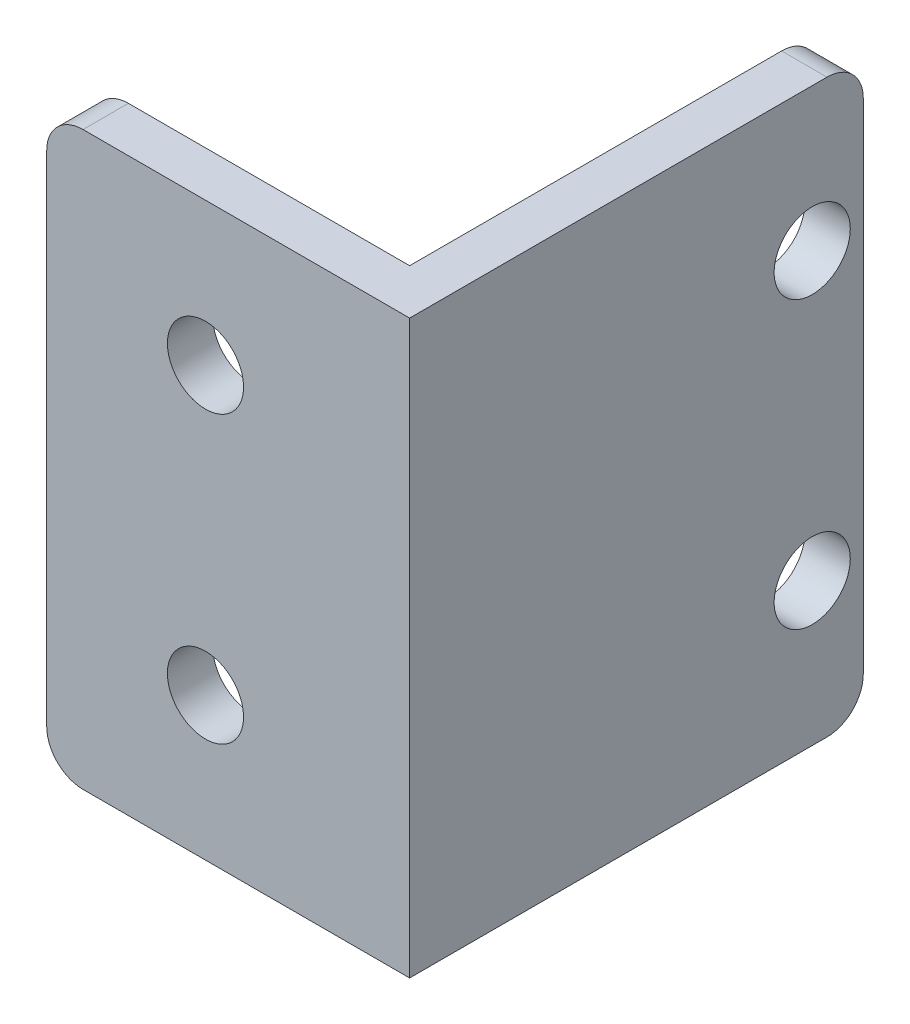
ISO-10303-21;
HEADER;
FILE_DESCRIPTION(('STEP AP214'),'2;1');
FILE_NAME('part.step','',(''),(''),'','','');
FILE_SCHEMA(('AUTOMOTIVE_DESIGN { 1 0 10303 214 1 1 1 1 }'));
ENDSEC;
DATA;
#1=APPLICATION_CONTEXT('core data for automotive mechanical design processes');
#2=APPLICATION_PROTOCOL_DEFINITION('international standard','automotive_design',2000,#1);
#3=PRODUCT_CONTEXT('',#1,'mechanical');
#4=PRODUCT('Part','Part','',(#3));
#5=PRODUCT_RELATED_PRODUCT_CATEGORY('part','',(#4));
#6=PRODUCT_DEFINITION_FORMATION('','',#4);
#7=PRODUCT_DEFINITION_CONTEXT('part definition',#1,'design');
#8=PRODUCT_DEFINITION('design','',#6,#7);
#9=PRODUCT_DEFINITION_SHAPE('','',#8);
#10=(LENGTH_UNIT() NAMED_UNIT(*) SI_UNIT(.MILLI.,.METRE.));
#11=(NAMED_UNIT(*) PLANE_ANGLE_UNIT() SI_UNIT($,.RADIAN.));
#12=(NAMED_UNIT(*) SI_UNIT($,.STERADIAN.) SOLID_ANGLE_UNIT());
#13=UNCERTAINTY_MEASURE_WITH_UNIT(LENGTH_MEASURE(1.E-05),#10,'distance_accuracy_value','');
#14=(GEOMETRIC_REPRESENTATION_CONTEXT(3) GLOBAL_UNCERTAINTY_ASSIGNED_CONTEXT((#13)) GLOBAL_UNIT_ASSIGNED_CONTEXT((#10,
#11,#12)) REPRESENTATION_CONTEXT('',''));
#15=CARTESIAN_POINT('',(0.,0.,0.));
#16=DIRECTION('',(0.,0.,1.));
#17=DIRECTION('',(1.,0.,0.));
#18=AXIS2_PLACEMENT_3D('',#15,#16,#17);
#19=CARTESIAN_POINT('',(0.,40.,-31.75));
#20=DIRECTION('',(-1.,0.,0.));
#21=DIRECTION('',(0.,0.,1.));
#22=AXIS2_PLACEMENT_3D('',#19,#20,#21);
#23=PLANE('',#22);
#24=CARTESIAN_POINT('',(0.,10.,-28.17625));
#25=DIRECTION('',(1.,0.,0.));
#26=DIRECTION('',(0.,0.,-1.));
#27=AXIS2_PLACEMENT_3D('',#24,#25,#26);
#28=CIRCLE('',#27,2.665);
#29=CARTESIAN_POINT('',(0.,10.,-30.84125));
#30=VERTEX_POINT('',#29);
#31=EDGE_CURVE('E247',#30,#30,#28,.T.);
#32=ORIENTED_EDGE('',*,*,#31,.F.);
#33=EDGE_LOOP('',(#32));
#34=FACE_BOUND('',#33,.T.);
#35=CARTESIAN_POINT('',(0.,30.,-28.17625));
#36=DIRECTION('',(1.,0.,0.));
#37=DIRECTION('',(0.,0.,-1.));
#38=AXIS2_PLACEMENT_3D('',#35,#36,#37);
#39=CIRCLE('',#38,2.665);
#40=CARTESIAN_POINT('',(0.,30.,-30.84125));
#41=VERTEX_POINT('',#40);
#42=EDGE_CURVE('E248',#41,#41,#39,.T.);
#43=ORIENTED_EDGE('',*,*,#42,.F.);
#44=EDGE_LOOP('',(#43));
#45=FACE_BOUND('',#44,.T.);
#46=DIRECTION('',(0.,-1.,0.));
#47=VECTOR('',#46,1.);
#48=CARTESIAN_POINT('',(0.,40.,-31.75));
#49=LINE('',#48,#47);
#50=CARTESIAN_POINT('',(0.,37.46,-31.75));
#51=VERTEX_POINT('',#50);
#52=CARTESIAN_POINT('',(0.,2.54,-31.75));
#53=VERTEX_POINT('',#52);
#54=EDGE_CURVE('E201',#51,#53,#49,.T.);
#55=ORIENTED_EDGE('',*,*,#54,.F.);
#56=CARTESIAN_POINT('',(0.,37.46,-29.21));
#57=DIRECTION('',(-1.,0.,0.));
#58=DIRECTION('',(0.,0.,1.));
#59=AXIS2_PLACEMENT_3D('',#56,#57,#58);
#60=CIRCLE('',#59,2.54);
#61=CARTESIAN_POINT('',(0.,40.,-29.21));
#62=VERTEX_POINT('',#61);
#63=EDGE_CURVE('E11',#51,#62,#60,.F.);
#64=ORIENTED_EDGE('',*,*,#63,.T.);
#65=DIRECTION('',(0.,0.,-1.));
#66=VECTOR('',#65,1.);
#67=CARTESIAN_POINT('',(0.,40.,-31.75));
#68=LINE('',#67,#66);
#69=CARTESIAN_POINT('',(0.,40.,0.));
#70=VERTEX_POINT('',#69);
#71=EDGE_CURVE('E149',#70,#62,#68,.T.);
#72=ORIENTED_EDGE('',*,*,#71,.F.);
#73=DIRECTION('',(0.,-1.,0.));
#74=VECTOR('',#73,1.);
#75=CARTESIAN_POINT('',(0.,40.,0.));
#76=LINE('',#75,#74);
#77=CARTESIAN_POINT('',(0.,0.,0.));
#78=VERTEX_POINT('',#77);
#79=EDGE_CURVE('E172',#70,#78,#76,.T.);
#80=ORIENTED_EDGE('',*,*,#79,.T.);
#81=DIRECTION('',(0.,0.,-1.));
#82=VECTOR('',#81,1.);
#83=CARTESIAN_POINT('',(0.,0.,-31.75));
#84=LINE('',#83,#82);
#85=CARTESIAN_POINT('',(0.,0.,-29.21));
#86=VERTEX_POINT('',#85);
#87=EDGE_CURVE('E176',#78,#86,#84,.T.);
#88=ORIENTED_EDGE('',*,*,#87,.T.);
#89=CARTESIAN_POINT('',(0.,2.54,-29.21));
#90=DIRECTION('',(-1.,0.,0.));
#91=DIRECTION('',(0.,0.,1.));
#92=AXIS2_PLACEMENT_3D('',#89,#90,#91);
#93=CIRCLE('',#92,2.54);
#94=EDGE_CURVE('E47',#86,#53,#93,.F.);
#95=ORIENTED_EDGE('',*,*,#94,.T.);
#96=EDGE_LOOP('',(#55,#64,#72,#80,#88,#95));
#97=FACE_BOUND('',#96,.T.);
#98=ADVANCED_FACE('F38',(#34,#45,#97),#23,.F.);
#99=CARTESIAN_POINT('',(-3.175,40.,-31.75));
#100=DIRECTION('',(0.,0.,1.));
#101=DIRECTION('',(1.,0.,0.));
#102=AXIS2_PLACEMENT_3D('',#99,#100,#101);
#103=PLANE('',#102);
#104=DIRECTION('',(0.,-1.,0.));
#105=VECTOR('',#104,1.);
#106=CARTESIAN_POINT('',(-3.175,40.,-31.75));
#107=LINE('',#106,#105);
#108=CARTESIAN_POINT('',(-3.175,37.46,-31.75));
#109=VERTEX_POINT('',#108);
#110=CARTESIAN_POINT('',(-3.175,2.54,-31.75));
#111=VERTEX_POINT('',#110);
#112=EDGE_CURVE('E160',#109,#111,#107,.T.);
#113=ORIENTED_EDGE('',*,*,#112,.F.);
#114=DIRECTION('',(-1.,0.,0.));
#115=VECTOR('',#114,1.);
#116=CARTESIAN_POINT('',(-3.175,37.46,-31.75));
#117=LINE('',#116,#115);
#118=EDGE_CURVE('E66',#109,#51,#117,.F.);
#119=ORIENTED_EDGE('',*,*,#118,.T.);
#120=ORIENTED_EDGE('',*,*,#54,.T.);
#121=DIRECTION('',(-1.,0.,0.));
#122=VECTOR('',#121,1.);
#123=CARTESIAN_POINT('',(-3.175,2.54,-31.75));
#124=LINE('',#123,#122);
#125=EDGE_CURVE('E238',#53,#111,#124,.T.);
#126=ORIENTED_EDGE('',*,*,#125,.T.);
#127=EDGE_LOOP('',(#113,#119,#120,#126));
#128=FACE_BOUND('',#127,.T.);
#129=ADVANCED_FACE('F280',(#128),#103,.F.);
#130=CARTESIAN_POINT('',(-3.175,40.,-3.175));
#131=DIRECTION('',(1.,0.,0.));
#132=DIRECTION('',(0.,0.,-1.));
#133=AXIS2_PLACEMENT_3D('',#130,#131,#132);
#134=PLANE('',#133);
#135=CARTESIAN_POINT('',(-3.175,10.,-28.17625));
#136=DIRECTION('',(1.,0.,0.));
#137=DIRECTION('',(0.,0.,-1.));
#138=AXIS2_PLACEMENT_3D('',#135,#136,#137);
#139=CIRCLE('',#138,2.665);
#140=CARTESIAN_POINT('',(-3.175,10.,-30.84125));
#141=VERTEX_POINT('',#140);
#142=EDGE_CURVE('E256',#141,#141,#139,.F.);
#143=ORIENTED_EDGE('',*,*,#142,.F.);
#144=EDGE_LOOP('',(#143));
#145=FACE_BOUND('',#144,.T.);
#146=CARTESIAN_POINT('',(-3.175,30.,-28.17625));
#147=DIRECTION('',(1.,0.,0.));
#148=DIRECTION('',(0.,0.,-1.));
#149=AXIS2_PLACEMENT_3D('',#146,#147,#148);
#150=CIRCLE('',#149,2.665);
#151=CARTESIAN_POINT('',(-3.175,30.,-30.84125));
#152=VERTEX_POINT('',#151);
#153=EDGE_CURVE('E245',#152,#152,#150,.F.);
#154=ORIENTED_EDGE('',*,*,#153,.F.);
#155=EDGE_LOOP('',(#154));
#156=FACE_BOUND('',#155,.T.);
#157=DIRECTION('',(0.,0.,1.));
#158=VECTOR('',#157,1.);
#159=CARTESIAN_POINT('',(-3.175,40.,-3.175));
#160=LINE('',#159,#158);
#161=CARTESIAN_POINT('',(-3.175,40.,-29.21));
#162=VERTEX_POINT('',#161);
#163=CARTESIAN_POINT('',(-3.175,40.,-3.175));
#164=VERTEX_POINT('',#163);
#165=EDGE_CURVE('E137',#162,#164,#160,.T.);
#166=ORIENTED_EDGE('',*,*,#165,.F.);
#167=CARTESIAN_POINT('',(-3.175,37.46,-29.21));
#168=DIRECTION('',(1.,0.,0.));
#169=DIRECTION('',(0.,0.,-1.));
#170=AXIS2_PLACEMENT_3D('',#167,#168,#169);
#171=CIRCLE('',#170,2.54);
#172=EDGE_CURVE('E235',#162,#109,#171,.F.);
#173=ORIENTED_EDGE('',*,*,#172,.T.);
#174=ORIENTED_EDGE('',*,*,#112,.T.);
#175=CARTESIAN_POINT('',(-3.175,2.54,-29.21));
#176=DIRECTION('',(1.,0.,0.));
#177=DIRECTION('',(0.,0.,-1.));
#178=AXIS2_PLACEMENT_3D('',#175,#176,#177);
#179=CIRCLE('',#178,2.54);
#180=CARTESIAN_POINT('',(-3.175,0.,-29.21));
#181=VERTEX_POINT('',#180);
#182=EDGE_CURVE('E232',#111,#181,#179,.F.);
#183=ORIENTED_EDGE('',*,*,#182,.T.);
#184=DIRECTION('',(0.,0.,1.));
#185=VECTOR('',#184,1.);
#186=CARTESIAN_POINT('',(-3.175,0.,-3.175));
#187=LINE('',#186,#185);
#188=CARTESIAN_POINT('',(-3.175,0.,-3.175));
#189=VERTEX_POINT('',#188);
#190=EDGE_CURVE('E155',#181,#189,#187,.T.);
#191=ORIENTED_EDGE('',*,*,#190,.T.);
#192=DIRECTION('',(0.,-1.,0.));
#193=VECTOR('',#192,1.);
#194=CARTESIAN_POINT('',(-3.175,40.,-3.175));
#195=LINE('',#194,#193);
#196=EDGE_CURVE('E152',#164,#189,#195,.T.);
#197=ORIENTED_EDGE('',*,*,#196,.F.);
#198=EDGE_LOOP('',(#166,#173,#174,#183,#191,#197));
#199=FACE_BOUND('',#198,.T.);
#200=ADVANCED_FACE('F153',(#145,#156,#199),#134,.F.);
#201=CARTESIAN_POINT('',(-25.4,40.,-3.175));
#202=DIRECTION('',(0.,0.,1.));
#203=DIRECTION('',(1.,0.,0.));
#204=AXIS2_PLACEMENT_3D('',#201,#202,#203);
#205=PLANE('',#204);
#206=CARTESIAN_POINT('',(-14.2875,30.,-3.175));
#207=DIRECTION('',(0.,0.,-1.));
#208=DIRECTION('',(-1.,0.,0.));
#209=AXIS2_PLACEMENT_3D('',#206,#207,#208);
#210=CIRCLE('',#209,2.665);
#211=CARTESIAN_POINT('',(-16.9525,30.,-3.175));
#212=VERTEX_POINT('',#211);
#213=EDGE_CURVE('E259',#212,#212,#210,.T.);
#214=ORIENTED_EDGE('',*,*,#213,.F.);
#215=EDGE_LOOP('',(#214));
#216=FACE_BOUND('',#215,.T.);
#217=CARTESIAN_POINT('',(-14.2875,10.,-3.175));
#218=DIRECTION('',(0.,0.,-1.));
#219=DIRECTION('',(-1.,0.,0.));
#220=AXIS2_PLACEMENT_3D('',#217,#218,#219);
#221=CIRCLE('',#220,2.665);
#222=CARTESIAN_POINT('',(-16.9525,10.,-3.175));
#223=VERTEX_POINT('',#222);
#224=EDGE_CURVE('E267',#223,#223,#221,.T.);
#225=ORIENTED_EDGE('',*,*,#224,.F.);
#226=EDGE_LOOP('',(#225));
#227=FACE_BOUND('',#226,.T.);
#228=DIRECTION('',(-1.,0.,0.));
#229=VECTOR('',#228,1.);
#230=CARTESIAN_POINT('',(-25.4,0.,-3.175));
#231=LINE('',#230,#229);
#232=CARTESIAN_POINT('',(-22.86,0.,-3.175));
#233=VERTEX_POINT('',#232);
#234=EDGE_CURVE('E182',#189,#233,#231,.T.);
#235=ORIENTED_EDGE('',*,*,#234,.T.);
#236=CARTESIAN_POINT('',(-22.86,2.54,-3.175));
#237=DIRECTION('',(0.,0.,1.));
#238=DIRECTION('',(1.,0.,0.));
#239=AXIS2_PLACEMENT_3D('',#236,#237,#238);
#240=CIRCLE('',#239,2.54);
#241=CARTESIAN_POINT('',(-25.4,2.54,-3.175));
#242=VERTEX_POINT('',#241);
#243=EDGE_CURVE('E225',#233,#242,#240,.F.);
#244=ORIENTED_EDGE('',*,*,#243,.T.);
#245=DIRECTION('',(0.,-1.,0.));
#246=VECTOR('',#245,1.);
#247=CARTESIAN_POINT('',(-25.4,40.,-3.175));
#248=LINE('',#247,#246);
#249=CARTESIAN_POINT('',(-25.4,37.46,-3.175));
#250=VERTEX_POINT('',#249);
#251=EDGE_CURVE('E161',#250,#242,#248,.T.);
#252=ORIENTED_EDGE('',*,*,#251,.F.);
#253=CARTESIAN_POINT('',(-22.86,37.46,-3.175));
#254=DIRECTION('',(0.,0.,1.));
#255=DIRECTION('',(1.,0.,0.));
#256=AXIS2_PLACEMENT_3D('',#253,#254,#255);
#257=CIRCLE('',#256,2.54);
#258=CARTESIAN_POINT('',(-22.86,40.,-3.175));
#259=VERTEX_POINT('',#258);
#260=EDGE_CURVE('E166',#250,#259,#257,.F.);
#261=ORIENTED_EDGE('',*,*,#260,.T.);
#262=DIRECTION('',(-1.,0.,0.));
#263=VECTOR('',#262,1.);
#264=CARTESIAN_POINT('',(-25.4,40.,-3.175));
#265=LINE('',#264,#263);
#266=EDGE_CURVE('E142',#164,#259,#265,.T.);
#267=ORIENTED_EDGE('',*,*,#266,.F.);
#268=ORIENTED_EDGE('',*,*,#196,.T.);
#269=EDGE_LOOP('',(#235,#244,#252,#261,#267,#268));
#270=FACE_BOUND('',#269,.T.);
#271=ADVANCED_FACE('F163',(#216,#227,#270),#205,.F.);
#272=CARTESIAN_POINT('',(-25.4,40.,0.));
#273=DIRECTION('',(1.,0.,0.));
#274=DIRECTION('',(0.,0.,-1.));
#275=AXIS2_PLACEMENT_3D('',#272,#273,#274);
#276=PLANE('',#275);
#277=ORIENTED_EDGE('',*,*,#251,.T.);
#278=DIRECTION('',(0.,0.,1.));
#279=VECTOR('',#278,1.);
#280=CARTESIAN_POINT('',(-25.4,2.54,0.));
#281=LINE('',#280,#279);
#282=CARTESIAN_POINT('',(-25.4,2.54,0.));
#283=VERTEX_POINT('',#282);
#284=EDGE_CURVE('E207',#242,#283,#281,.T.);
#285=ORIENTED_EDGE('',*,*,#284,.T.);
#286=DIRECTION('',(0.,-1.,0.));
#287=VECTOR('',#286,1.);
#288=CARTESIAN_POINT('',(-25.4,40.,0.));
#289=LINE('',#288,#287);
#290=CARTESIAN_POINT('',(-25.4,37.46,0.));
#291=VERTEX_POINT('',#290);
#292=EDGE_CURVE('E191',#291,#283,#289,.T.);
#293=ORIENTED_EDGE('',*,*,#292,.F.);
#294=DIRECTION('',(0.,0.,1.));
#295=VECTOR('',#294,1.);
#296=CARTESIAN_POINT('',(-25.4,37.46,0.));
#297=LINE('',#296,#295);
#298=EDGE_CURVE('E204',#291,#250,#297,.F.);
#299=ORIENTED_EDGE('',*,*,#298,.T.);
#300=EDGE_LOOP('',(#277,#285,#293,#299));
#301=FACE_BOUND('',#300,.T.);
#302=ADVANCED_FACE('F295',(#301),#276,.F.);
#303=CARTESIAN_POINT('',(0.,40.,0.));
#304=DIRECTION('',(0.,0.,-1.));
#305=DIRECTION('',(-1.,0.,0.));
#306=AXIS2_PLACEMENT_3D('',#303,#304,#305);
#307=PLANE('',#306);
#308=CARTESIAN_POINT('',(-14.2875,30.,0.));
#309=DIRECTION('',(0.,0.,-1.));
#310=DIRECTION('',(-1.,0.,0.));
#311=AXIS2_PLACEMENT_3D('',#308,#309,#310);
#312=CIRCLE('',#311,2.665);
#313=CARTESIAN_POINT('',(-16.9525,30.,0.));
#314=VERTEX_POINT('',#313);
#315=EDGE_CURVE('E179',#314,#314,#312,.F.);
#316=ORIENTED_EDGE('',*,*,#315,.F.);
#317=EDGE_LOOP('',(#316));
#318=FACE_BOUND('',#317,.T.);
#319=CARTESIAN_POINT('',(-14.2875,10.,0.));
#320=DIRECTION('',(0.,0.,-1.));
#321=DIRECTION('',(-1.,0.,0.));
#322=AXIS2_PLACEMENT_3D('',#319,#320,#321);
#323=CIRCLE('',#322,2.665);
#324=CARTESIAN_POINT('',(-16.9525,10.,0.));
#325=VERTEX_POINT('',#324);
#326=EDGE_CURVE('E263',#325,#325,#323,.F.);
#327=ORIENTED_EDGE('',*,*,#326,.F.);
#328=EDGE_LOOP('',(#327));
#329=FACE_BOUND('',#328,.T.);
#330=ORIENTED_EDGE('',*,*,#292,.T.);
#331=CARTESIAN_POINT('',(-22.86,2.54,0.));
#332=DIRECTION('',(0.,0.,-1.));
#333=DIRECTION('',(-1.,0.,0.));
#334=AXIS2_PLACEMENT_3D('',#331,#332,#333);
#335=CIRCLE('',#334,2.54);
#336=CARTESIAN_POINT('',(-22.86,0.,0.));
#337=VERTEX_POINT('',#336);
#338=EDGE_CURVE('E214',#283,#337,#335,.F.);
#339=ORIENTED_EDGE('',*,*,#338,.T.);
#340=DIRECTION('',(1.,0.,0.));
#341=VECTOR('',#340,1.);
#342=CARTESIAN_POINT('',(0.,0.,0.));
#343=LINE('',#342,#341);
#344=EDGE_CURVE('E185',#337,#78,#343,.T.);
#345=ORIENTED_EDGE('',*,*,#344,.T.);
#346=ORIENTED_EDGE('',*,*,#79,.F.);
#347=DIRECTION('',(1.,0.,0.));
#348=VECTOR('',#347,1.);
#349=CARTESIAN_POINT('',(0.,40.,0.));
#350=LINE('',#349,#348);
#351=CARTESIAN_POINT('',(-22.86,40.,0.));
#352=VERTEX_POINT('',#351);
#353=EDGE_CURVE('E168',#352,#70,#350,.T.);
#354=ORIENTED_EDGE('',*,*,#353,.F.);
#355=CARTESIAN_POINT('',(-22.86,37.46,0.));
#356=DIRECTION('',(0.,0.,-1.));
#357=DIRECTION('',(-1.,0.,0.));
#358=AXIS2_PLACEMENT_3D('',#355,#356,#357);
#359=CIRCLE('',#358,2.54);
#360=EDGE_CURVE('E211',#352,#291,#359,.F.);
#361=ORIENTED_EDGE('',*,*,#360,.T.);
#362=EDGE_LOOP('',(#330,#339,#345,#346,#354,#361));
#363=FACE_BOUND('',#362,.T.);
#364=ADVANCED_FACE('F298',(#318,#329,#363),#307,.F.);
#365=CARTESIAN_POINT('',(0.,40.,0.));
#366=DIRECTION('',(0.,-1.,0.));
#367=DIRECTION('',(0.,0.,-1.));
#368=AXIS2_PLACEMENT_3D('',#365,#366,#367);
#369=PLANE('',#368);
#370=ORIENTED_EDGE('',*,*,#266,.T.);
#371=DIRECTION('',(0.,0.,1.));
#372=VECTOR('',#371,1.);
#373=CARTESIAN_POINT('',(-22.86,40.,0.));
#374=LINE('',#373,#372);
#375=EDGE_CURVE('E230',#259,#352,#374,.T.);
#376=ORIENTED_EDGE('',*,*,#375,.T.);
#377=ORIENTED_EDGE('',*,*,#353,.T.);
#378=ORIENTED_EDGE('',*,*,#71,.T.);
#379=DIRECTION('',(-1.,0.,0.));
#380=VECTOR('',#379,1.);
#381=CARTESIAN_POINT('',(0.,40.,-29.21));
#382=LINE('',#381,#380);
#383=EDGE_CURVE('E146',#62,#162,#382,.T.);
#384=ORIENTED_EDGE('',*,*,#383,.T.);
#385=ORIENTED_EDGE('',*,*,#165,.T.);
#386=EDGE_LOOP('',(#370,#376,#377,#378,#384,#385));
#387=FACE_BOUND('',#386,.T.);
#388=ADVANCED_FACE('F139',(#387),#369,.F.);
#389=CARTESIAN_POINT('',(0.,0.,0.));
#390=DIRECTION('',(0.,-1.,0.));
#391=DIRECTION('',(0.,0.,-1.));
#392=AXIS2_PLACEMENT_3D('',#389,#390,#391);
#393=PLANE('',#392);
#394=ORIENTED_EDGE('',*,*,#344,.F.);
#395=DIRECTION('',(0.,0.,1.));
#396=VECTOR('',#395,1.);
#397=CARTESIAN_POINT('',(-22.86,0.,-3.175));
#398=LINE('',#397,#396);
#399=EDGE_CURVE('E220',#337,#233,#398,.F.);
#400=ORIENTED_EDGE('',*,*,#399,.T.);
#401=ORIENTED_EDGE('',*,*,#234,.F.);
#402=ORIENTED_EDGE('',*,*,#190,.F.);
#403=DIRECTION('',(-1.,0.,0.));
#404=VECTOR('',#403,1.);
#405=CARTESIAN_POINT('',(0.,0.,-29.21));
#406=LINE('',#405,#404);
#407=EDGE_CURVE('E217',#181,#86,#406,.F.);
#408=ORIENTED_EDGE('',*,*,#407,.T.);
#409=ORIENTED_EDGE('',*,*,#87,.F.);
#410=EDGE_LOOP('',(#394,#400,#401,#402,#408,#409));
#411=FACE_BOUND('',#410,.T.);
#412=ADVANCED_FACE('F286',(#411),#393,.T.);
#413=CARTESIAN_POINT('',(-14.2875,10.,0.00100000000000404));
#414=DIRECTION('',(0.,0.,-1.));
#415=DIRECTION('',(-1.,0.,0.));
#416=AXIS2_PLACEMENT_3D('',#413,#414,#415);
#417=CYLINDRICAL_SURFACE('',#416,2.665);
#418=ORIENTED_EDGE('',*,*,#224,.T.);
#419=EDGE_LOOP('',(#418));
#420=FACE_BOUND('',#419,.T.);
#421=ORIENTED_EDGE('',*,*,#326,.T.);
#422=EDGE_LOOP('',(#421));
#423=FACE_BOUND('',#422,.T.);
#424=ADVANCED_FACE('F332',(#420,#423),#417,.F.);
#425=CARTESIAN_POINT('',(-14.2875,30.,0.00100000000000404));
#426=DIRECTION('',(0.,0.,-1.));
#427=DIRECTION('',(-1.,0.,0.));
#428=AXIS2_PLACEMENT_3D('',#425,#426,#427);
#429=CYLINDRICAL_SURFACE('',#428,2.665);
#430=ORIENTED_EDGE('',*,*,#213,.T.);
#431=EDGE_LOOP('',(#430));
#432=FACE_BOUND('',#431,.T.);
#433=ORIENTED_EDGE('',*,*,#315,.T.);
#434=EDGE_LOOP('',(#433));
#435=FACE_BOUND('',#434,.T.);
#436=ADVANCED_FACE('F337',(#432,#435),#429,.F.);
#437=CARTESIAN_POINT('',(-25.401,30.,-28.17625));
#438=DIRECTION('',(1.,0.,0.));
#439=DIRECTION('',(0.,0.,-1.));
#440=AXIS2_PLACEMENT_3D('',#437,#438,#439);
#441=CYLINDRICAL_SURFACE('',#440,2.665);
#442=CARTESIAN_POINT('',(0.,30.,-30.84125));
#443=CARTESIAN_POINT('',(-0.0330729166666636,30.,-30.84125));
#444=CARTESIAN_POINT('',(-0.0661458333333307,30.,-30.84125));
#445=CARTESIAN_POINT('',(-0.132291666666664,30.,-30.84125));
#446=CARTESIAN_POINT('',(-0.16536458333333,30.,-30.84125));
#447=CARTESIAN_POINT('',(-0.231510416666663,30.,-30.84125));
#448=CARTESIAN_POINT('',(-0.26458333333333,30.,-30.84125));
#449=CARTESIAN_POINT('',(-0.330729166666664,30.,-30.84125));
#450=CARTESIAN_POINT('',(-0.363802083333331,30.,-30.84125));
#451=CARTESIAN_POINT('',(-0.429947916666664,30.,-30.84125));
#452=CARTESIAN_POINT('',(-0.46302083333333,30.,-30.84125));
#453=CARTESIAN_POINT('',(-0.529166666666663,30.,-30.84125));
#454=CARTESIAN_POINT('',(-0.56223958333333,30.,-30.84125));
#455=CARTESIAN_POINT('',(-0.628385416666664,30.,-30.84125));
#456=CARTESIAN_POINT('',(-0.661458333333331,30.,-30.84125));
#457=CARTESIAN_POINT('',(-0.727604166666665,30.,-30.84125));
#458=CARTESIAN_POINT('',(-0.760677083333332,30.,-30.84125));
#459=CARTESIAN_POINT('',(-0.826822916666665,30.,-30.84125));
#460=CARTESIAN_POINT('',(-0.859895833333331,30.,-30.84125));
#461=CARTESIAN_POINT('',(-0.926041666666664,30.,-30.84125));
#462=CARTESIAN_POINT('',(-0.959114583333331,30.,-30.84125));
#463=CARTESIAN_POINT('',(-1.02526041666667,30.,-30.84125));
#464=CARTESIAN_POINT('',(-1.05833333333333,30.,-30.84125));
#465=CARTESIAN_POINT('',(-1.12447916666667,30.,-30.84125));
#466=CARTESIAN_POINT('',(-1.15755208333333,30.,-30.84125));
#467=CARTESIAN_POINT('',(-1.22369791666666,30.,-30.84125));
#468=CARTESIAN_POINT('',(-1.25677083333333,30.,-30.84125));
#469=CARTESIAN_POINT('',(-1.32291666666667,30.,-30.84125));
#470=CARTESIAN_POINT('',(-1.35598958333333,30.,-30.84125));
#471=CARTESIAN_POINT('',(-1.42213541666667,30.,-30.84125));
#472=CARTESIAN_POINT('',(-1.45520833333333,30.,-30.84125));
#473=CARTESIAN_POINT('',(-1.52135416666666,30.,-30.84125));
#474=CARTESIAN_POINT('',(-1.55442708333333,30.,-30.84125));
#475=CARTESIAN_POINT('',(-1.62057291666667,30.,-30.84125));
#476=CARTESIAN_POINT('',(-1.65364583333333,30.,-30.84125));
#477=CARTESIAN_POINT('',(-1.71979166666667,30.,-30.84125));
#478=CARTESIAN_POINT('',(-1.75286458333333,30.,-30.84125));
#479=CARTESIAN_POINT('',(-1.81901041666666,30.,-30.84125));
#480=CARTESIAN_POINT('',(-1.85208333333333,30.,-30.84125));
#481=CARTESIAN_POINT('',(-1.91822916666667,30.,-30.84125));
#482=CARTESIAN_POINT('',(-1.95130208333333,30.,-30.84125));
#483=CARTESIAN_POINT('',(-2.01744791666667,30.,-30.84125));
#484=CARTESIAN_POINT('',(-2.05052083333333,30.,-30.84125));
#485=CARTESIAN_POINT('',(-2.11666666666666,30.,-30.84125));
#486=CARTESIAN_POINT('',(-2.14973958333333,30.,-30.84125));
#487=CARTESIAN_POINT('',(-2.21588541666667,30.,-30.84125));
#488=CARTESIAN_POINT('',(-2.24895833333333,30.,-30.84125));
#489=CARTESIAN_POINT('',(-2.31510416666667,30.,-30.84125));
#490=CARTESIAN_POINT('',(-2.34817708333333,30.,-30.84125));
#491=CARTESIAN_POINT('',(-2.41432291666667,30.,-30.84125));
#492=CARTESIAN_POINT('',(-2.44739583333333,30.,-30.84125));
#493=CARTESIAN_POINT('',(-2.51354166666667,30.,-30.84125));
#494=CARTESIAN_POINT('',(-2.54661458333333,30.,-30.84125));
#495=CARTESIAN_POINT('',(-2.61276041666667,30.,-30.84125));
#496=CARTESIAN_POINT('',(-2.64583333333333,30.,-30.84125));
#497=CARTESIAN_POINT('',(-2.71197916666667,30.,-30.84125));
#498=CARTESIAN_POINT('',(-2.74505208333333,30.,-30.84125));
#499=CARTESIAN_POINT('',(-2.81119791666667,30.,-30.84125));
#500=CARTESIAN_POINT('',(-2.84427083333333,30.,-30.84125));
#501=CARTESIAN_POINT('',(-2.91041666666667,30.,-30.84125));
#502=CARTESIAN_POINT('',(-2.94348958333333,30.,-30.84125));
#503=CARTESIAN_POINT('',(-3.00963541666667,30.,-30.84125));
#504=CARTESIAN_POINT('',(-3.04270833333333,30.,-30.84125));
#505=CARTESIAN_POINT('',(-3.10885416666667,30.,-30.84125));
#506=CARTESIAN_POINT('',(-3.14192708333333,30.,-30.84125));
#507=CARTESIAN_POINT('',(-3.175,30.,-30.84125));
#508=B_SPLINE_CURVE_WITH_KNOTS('',3,(#442,#443,#444,#445,#446,#447,#448,#449,#450,#451,#452,
#453,#454,#455,#456,#457,#458,#459,#460,#461,#462,#463,#464,#465,#466,#467,#468,#469,#470,#471,
#472,#473,#474,#475,#476,#477,#478,#479,#480,#481,#482,#483,#484,#485,#486,#487,#488,#489,#490,
#491,#492,#493,#494,#495,#496,#497,#498,#499,#500,#501,#502,#503,#504,#505,#506,#507),
.UNSPECIFIED.,.F.,.F.,(4,2,2,2,2,2,2,2,2,2,2,2,2,2,2,2,2,2,2,2,2,2,2,2,2,2,2,2,2,2,2,2,4),(0.,
0.0992187500000012,0.198437499999999,0.29765625,0.396875000000001,0.496093749999999,0.5953125,
0.694531250000002,0.793750000000003,0.892968750000001,0.992187500000002,1.09140625,1.190625,
1.28984375,1.3890625,1.48828125,1.5875,1.68671875,1.7859375,1.88515625,1.984375,2.08359375,
2.1828125,2.28203125,2.38125,2.48046875,2.5796875,2.67890625,2.778125,2.87734375,
2.97656250000001,3.07578125,3.175),.UNSPECIFIED.);
#509=EDGE_CURVE('BSEAM341',#41,#152,#508,.T.);
#510=ORIENTED_EDGE('',*,*,#42,.T.);
#511=ORIENTED_EDGE('',*,*,#153,.T.);
#512=ORIENTED_EDGE('',*,*,#509,.T.);
#513=ORIENTED_EDGE('',*,*,#509,.F.);
#514=EDGE_LOOP('',(#510,#512,#511,#513));
#515=FACE_BOUND('',#514,.T.);
#516=ADVANCED_FACE('F341',(#515),#441,.F.);
#517=CARTESIAN_POINT('',(-25.401,10.,-28.17625));
#518=DIRECTION('',(1.,0.,0.));
#519=DIRECTION('',(0.,0.,-1.));
#520=AXIS2_PLACEMENT_3D('',#517,#518,#519);
#521=CYLINDRICAL_SURFACE('',#520,2.665);
#522=CARTESIAN_POINT('',(0.,10.,-30.84125));
#523=CARTESIAN_POINT('',(-0.0330729166666636,10.,-30.84125));
#524=CARTESIAN_POINT('',(-0.0661458333333307,10.,-30.84125));
#525=CARTESIAN_POINT('',(-0.132291666666664,10.,-30.84125));
#526=CARTESIAN_POINT('',(-0.16536458333333,10.,-30.84125));
#527=CARTESIAN_POINT('',(-0.231510416666663,10.,-30.84125));
#528=CARTESIAN_POINT('',(-0.26458333333333,10.,-30.84125));
#529=CARTESIAN_POINT('',(-0.330729166666664,10.,-30.84125));
#530=CARTESIAN_POINT('',(-0.363802083333331,10.,-30.84125));
#531=CARTESIAN_POINT('',(-0.429947916666664,10.,-30.84125));
#532=CARTESIAN_POINT('',(-0.46302083333333,10.,-30.84125));
#533=CARTESIAN_POINT('',(-0.529166666666663,10.,-30.84125));
#534=CARTESIAN_POINT('',(-0.56223958333333,10.,-30.84125));
#535=CARTESIAN_POINT('',(-0.628385416666664,10.,-30.84125));
#536=CARTESIAN_POINT('',(-0.661458333333331,10.,-30.84125));
#537=CARTESIAN_POINT('',(-0.727604166666665,10.,-30.84125));
#538=CARTESIAN_POINT('',(-0.760677083333332,10.,-30.84125));
#539=CARTESIAN_POINT('',(-0.826822916666665,10.,-30.84125));
#540=CARTESIAN_POINT('',(-0.859895833333331,10.,-30.84125));
#541=CARTESIAN_POINT('',(-0.926041666666664,10.,-30.84125));
#542=CARTESIAN_POINT('',(-0.959114583333331,10.,-30.84125));
#543=CARTESIAN_POINT('',(-1.02526041666667,10.,-30.84125));
#544=CARTESIAN_POINT('',(-1.05833333333333,10.,-30.84125));
#545=CARTESIAN_POINT('',(-1.12447916666667,10.,-30.84125));
#546=CARTESIAN_POINT('',(-1.15755208333333,10.,-30.84125));
#547=CARTESIAN_POINT('',(-1.22369791666666,10.,-30.84125));
#548=CARTESIAN_POINT('',(-1.25677083333333,10.,-30.84125));
#549=CARTESIAN_POINT('',(-1.32291666666667,10.,-30.84125));
#550=CARTESIAN_POINT('',(-1.35598958333333,10.,-30.84125));
#551=CARTESIAN_POINT('',(-1.42213541666667,10.,-30.84125));
#552=CARTESIAN_POINT('',(-1.45520833333333,10.,-30.84125));
#553=CARTESIAN_POINT('',(-1.52135416666666,10.,-30.84125));
#554=CARTESIAN_POINT('',(-1.55442708333333,10.,-30.84125));
#555=CARTESIAN_POINT('',(-1.62057291666667,10.,-30.84125));
#556=CARTESIAN_POINT('',(-1.65364583333333,10.,-30.84125));
#557=CARTESIAN_POINT('',(-1.71979166666667,10.,-30.84125));
#558=CARTESIAN_POINT('',(-1.75286458333333,10.,-30.84125));
#559=CARTESIAN_POINT('',(-1.81901041666666,10.,-30.84125));
#560=CARTESIAN_POINT('',(-1.85208333333333,10.,-30.84125));
#561=CARTESIAN_POINT('',(-1.91822916666667,10.,-30.84125));
#562=CARTESIAN_POINT('',(-1.95130208333333,10.,-30.84125));
#563=CARTESIAN_POINT('',(-2.01744791666667,10.,-30.84125));
#564=CARTESIAN_POINT('',(-2.05052083333333,10.,-30.84125));
#565=CARTESIAN_POINT('',(-2.11666666666666,10.,-30.84125));
#566=CARTESIAN_POINT('',(-2.14973958333333,10.,-30.84125));
#567=CARTESIAN_POINT('',(-2.21588541666667,10.,-30.84125));
#568=CARTESIAN_POINT('',(-2.24895833333333,10.,-30.84125));
#569=CARTESIAN_POINT('',(-2.31510416666667,10.,-30.84125));
#570=CARTESIAN_POINT('',(-2.34817708333333,10.,-30.84125));
#571=CARTESIAN_POINT('',(-2.41432291666667,10.,-30.84125));
#572=CARTESIAN_POINT('',(-2.44739583333333,10.,-30.84125));
#573=CARTESIAN_POINT('',(-2.51354166666667,10.,-30.84125));
#574=CARTESIAN_POINT('',(-2.54661458333333,10.,-30.84125));
#575=CARTESIAN_POINT('',(-2.61276041666667,10.,-30.84125));
#576=CARTESIAN_POINT('',(-2.64583333333333,10.,-30.84125));
#577=CARTESIAN_POINT('',(-2.71197916666667,10.,-30.84125));
#578=CARTESIAN_POINT('',(-2.74505208333333,10.,-30.84125));
#579=CARTESIAN_POINT('',(-2.81119791666667,10.,-30.84125));
#580=CARTESIAN_POINT('',(-2.84427083333333,10.,-30.84125));
#581=CARTESIAN_POINT('',(-2.91041666666667,10.,-30.84125));
#582=CARTESIAN_POINT('',(-2.94348958333333,10.,-30.84125));
#583=CARTESIAN_POINT('',(-3.00963541666667,10.,-30.84125));
#584=CARTESIAN_POINT('',(-3.04270833333333,10.,-30.84125));
#585=CARTESIAN_POINT('',(-3.10885416666667,10.,-30.84125));
#586=CARTESIAN_POINT('',(-3.14192708333333,10.,-30.84125));
#587=CARTESIAN_POINT('',(-3.175,10.,-30.84125));
#588=B_SPLINE_CURVE_WITH_KNOTS('',3,(#522,#523,#524,#525,#526,#527,#528,#529,#530,#531,#532,
#533,#534,#535,#536,#537,#538,#539,#540,#541,#542,#543,#544,#545,#546,#547,#548,#549,#550,#551,
#552,#553,#554,#555,#556,#557,#558,#559,#560,#561,#562,#563,#564,#565,#566,#567,#568,#569,#570,
#571,#572,#573,#574,#575,#576,#577,#578,#579,#580,#581,#582,#583,#584,#585,#586,#587),
.UNSPECIFIED.,.F.,.F.,(4,2,2,2,2,2,2,2,2,2,2,2,2,2,2,2,2,2,2,2,2,2,2,2,2,2,2,2,2,2,2,2,4),(0.,
0.0992187500000012,0.198437499999999,0.29765625,0.396875000000001,0.496093749999999,0.5953125,
0.694531250000002,0.793750000000003,0.892968750000001,0.992187500000002,1.09140625,1.190625,
1.28984375,1.3890625,1.48828125,1.5875,1.68671875,1.7859375,1.88515625,1.984375,2.08359375,
2.1828125,2.28203125,2.38125,2.48046875,2.5796875,2.67890625,2.778125,2.87734375,
2.97656250000001,3.07578125,3.175),.UNSPECIFIED.);
#589=EDGE_CURVE('BSEAM307',#30,#141,#588,.T.);
#590=ORIENTED_EDGE('',*,*,#31,.T.);
#591=ORIENTED_EDGE('',*,*,#142,.T.);
#592=ORIENTED_EDGE('',*,*,#589,.T.);
#593=ORIENTED_EDGE('',*,*,#589,.F.);
#594=EDGE_LOOP('',(#590,#592,#591,#593));
#595=FACE_BOUND('',#594,.T.);
#596=ADVANCED_FACE('F307',(#595),#521,.F.);
#597=CARTESIAN_POINT('',(-22.86,2.54,0.));
#598=DIRECTION('',(0.,0.,-1.));
#599=DIRECTION('',(-1.,0.,0.));
#600=AXIS2_PLACEMENT_3D('',#597,#598,#599);
#601=CYLINDRICAL_SURFACE('',#600,2.54);
#602=ORIENTED_EDGE('',*,*,#243,.F.);
#603=ORIENTED_EDGE('',*,*,#399,.F.);
#604=ORIENTED_EDGE('',*,*,#338,.F.);
#605=ORIENTED_EDGE('',*,*,#284,.F.);
#606=EDGE_LOOP('',(#602,#603,#604,#605));
#607=FACE_BOUND('',#606,.T.);
#608=ADVANCED_FACE('F292',(#607),#601,.T.);
#609=CARTESIAN_POINT('',(-22.86,37.46,0.));
#610=DIRECTION('',(0.,0.,1.));
#611=DIRECTION('',(1.,0.,0.));
#612=AXIS2_PLACEMENT_3D('',#609,#610,#611);
#613=CYLINDRICAL_SURFACE('',#612,2.54);
#614=ORIENTED_EDGE('',*,*,#260,.F.);
#615=ORIENTED_EDGE('',*,*,#298,.F.);
#616=ORIENTED_EDGE('',*,*,#360,.F.);
#617=ORIENTED_EDGE('',*,*,#375,.F.);
#618=EDGE_LOOP('',(#614,#615,#616,#617));
#619=FACE_BOUND('',#618,.T.);
#620=ADVANCED_FACE('F300',(#619),#613,.T.);
#621=CARTESIAN_POINT('',(0.,37.46,-29.21));
#622=DIRECTION('',(-1.,0.,0.));
#623=DIRECTION('',(0.,0.,1.));
#624=AXIS2_PLACEMENT_3D('',#621,#622,#623);
#625=CYLINDRICAL_SURFACE('',#624,2.54);
#626=ORIENTED_EDGE('',*,*,#63,.F.);
#627=ORIENTED_EDGE('',*,*,#118,.F.);
#628=ORIENTED_EDGE('',*,*,#172,.F.);
#629=ORIENTED_EDGE('',*,*,#383,.F.);
#630=EDGE_LOOP('',(#626,#627,#628,#629));
#631=FACE_BOUND('',#630,.T.);
#632=ADVANCED_FACE('F279',(#631),#625,.T.);
#633=CARTESIAN_POINT('',(-3.175,2.54,-29.21));
#634=DIRECTION('',(1.,0.,0.));
#635=DIRECTION('',(0.,0.,-1.));
#636=AXIS2_PLACEMENT_3D('',#633,#634,#635);
#637=CYLINDRICAL_SURFACE('',#636,2.54);
#638=ORIENTED_EDGE('',*,*,#94,.F.);
#639=ORIENTED_EDGE('',*,*,#407,.F.);
#640=ORIENTED_EDGE('',*,*,#182,.F.);
#641=ORIENTED_EDGE('',*,*,#125,.F.);
#642=EDGE_LOOP('',(#638,#639,#640,#641));
#643=FACE_BOUND('',#642,.T.);
#644=ADVANCED_FACE('F40',(#643),#637,.T.);
#645=CLOSED_SHELL('',(#98,#129,#200,#271,#302,#364,#388,#412,#424,#436,#516,#596,#608,#620,#632,#644));
#646=MANIFOLD_SOLID_BREP('B2',#645);
#647=ADVANCED_BREP_SHAPE_REPRESENTATION('',(#18,#646),#14);
#648=SHAPE_DEFINITION_REPRESENTATION(#9,#647);
ENDSEC;
END-ISO-10303-21;
